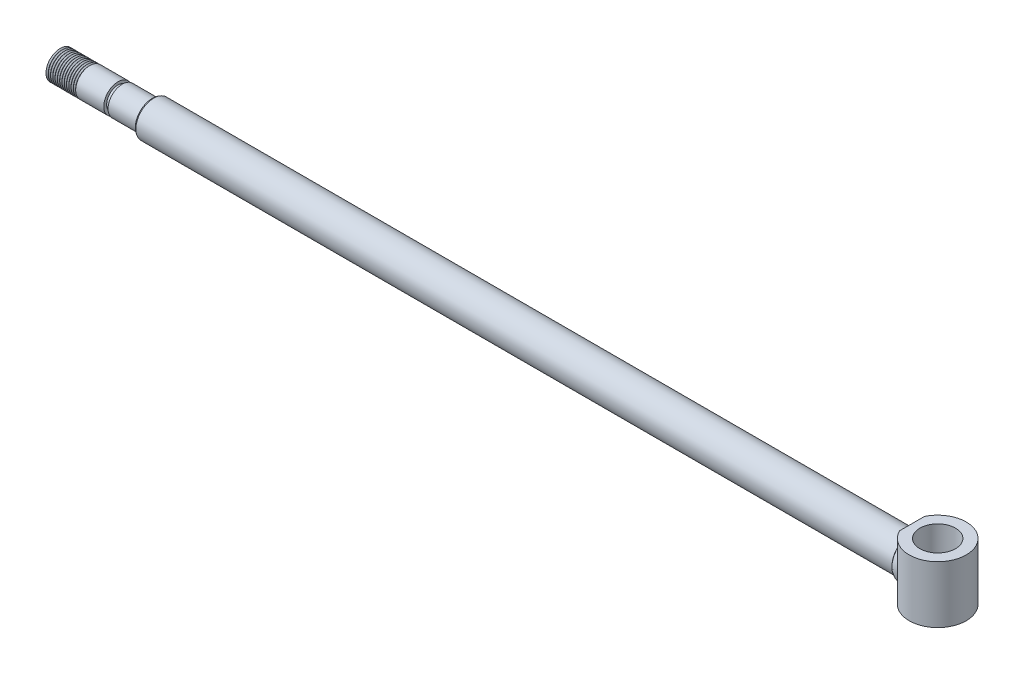
ISO-10303-21;
HEADER;
FILE_DESCRIPTION(('STEP AP214'),'2;1');
FILE_NAME('part.step','',(''),(''),'','','');
FILE_SCHEMA(('AUTOMOTIVE_DESIGN { 1 0 10303 214 1 1 1 1 }'));
ENDSEC;
DATA;
#1=APPLICATION_CONTEXT('core data for automotive mechanical design processes');
#2=APPLICATION_PROTOCOL_DEFINITION('international standard','automotive_design',2000,#1);
#3=PRODUCT_CONTEXT('',#1,'mechanical');
#4=PRODUCT('Part','Part','',(#3));
#5=PRODUCT_RELATED_PRODUCT_CATEGORY('part','',(#4));
#6=PRODUCT_DEFINITION_FORMATION('','',#4);
#7=PRODUCT_DEFINITION_CONTEXT('part definition',#1,'design');
#8=PRODUCT_DEFINITION('design','',#6,#7);
#9=PRODUCT_DEFINITION_SHAPE('','',#8);
#10=(LENGTH_UNIT() NAMED_UNIT(*) SI_UNIT(.MILLI.,.METRE.));
#11=(NAMED_UNIT(*) PLANE_ANGLE_UNIT() SI_UNIT($,.RADIAN.));
#12=(NAMED_UNIT(*) SI_UNIT($,.STERADIAN.) SOLID_ANGLE_UNIT());
#13=UNCERTAINTY_MEASURE_WITH_UNIT(LENGTH_MEASURE(1.E-05),#10,'distance_accuracy_value','');
#14=(GEOMETRIC_REPRESENTATION_CONTEXT(3) GLOBAL_UNCERTAINTY_ASSIGNED_CONTEXT((#13)) GLOBAL_UNIT_ASSIGNED_CONTEXT((#10,
#11,#12)) REPRESENTATION_CONTEXT('',''));
#15=CARTESIAN_POINT('',(0.,0.,0.));
#16=DIRECTION('',(0.,0.,1.));
#17=DIRECTION('',(1.,0.,0.));
#18=AXIS2_PLACEMENT_3D('',#15,#16,#17);
#19=CARTESIAN_POINT('',(0.,0.,0.));
#20=DIRECTION('',(-1.,0.,0.));
#21=DIRECTION('',(0.,0.,1.));
#22=AXIS2_PLACEMENT_3D('',#19,#20,#21);
#23=CYLINDRICAL_SURFACE('',#22,12.5);
#24=CARTESIAN_POINT('',(65.5000000000001,0.,0.));
#25=DIRECTION('',(1.,0.,0.));
#26=DIRECTION('',(0.,0.,-1.));
#27=AXIS2_PLACEMENT_3D('',#24,#25,#26);
#28=CIRCLE('',#27,12.5);
#29=CARTESIAN_POINT('',(65.5000000000001,0.,-12.5));
#30=VERTEX_POINT('',#29);
#31=EDGE_CURVE('E296',#30,#30,#28,.T.);
#32=ORIENTED_EDGE('',*,*,#31,.T.);
#33=EDGE_LOOP('',(#32));
#34=FACE_BOUND('',#33,.T.);
#35=CARTESIAN_POINT('',(595.500323734356,0.,0.));
#36=DIRECTION('',(-1.,0.,0.));
#37=DIRECTION('',(0.,0.,1.));
#38=AXIS2_PLACEMENT_3D('',#35,#36,#37);
#39=CIRCLE('',#38,12.5);
#40=CARTESIAN_POINT('',(595.500323734356,12.5,0.));
#41=VERTEX_POINT('',#40);
#42=EDGE_CURVE('E11',#41,#41,#39,.F.);
#43=ORIENTED_EDGE('',*,*,#42,.F.);
#44=EDGE_LOOP('',(#43));
#45=FACE_BOUND('',#44,.T.);
#46=ADVANCED_FACE('F34',(#34,#45),#23,.T.);
#47=CARTESIAN_POINT('',(0.,0.,0.));
#48=DIRECTION('',(1.,0.,0.));
#49=DIRECTION('',(0.,0.,-1.));
#50=AXIS2_PLACEMENT_3D('',#47,#48,#49);
#51=PLANE('',#50);
#52=CARTESIAN_POINT('',(0.,0.,0.));
#53=DIRECTION('',(-1.,0.,0.));
#54=DIRECTION('',(0.,0.,1.));
#55=AXIS2_PLACEMENT_3D('',#52,#53,#54);
#56=CIRCLE('',#55,10.);
#57=CARTESIAN_POINT('',(0.,0.,10.));
#58=VERTEX_POINT('',#57);
#59=EDGE_CURVE('E281',#58,#58,#56,.T.);
#60=ORIENTED_EDGE('',*,*,#59,.T.);
#61=EDGE_LOOP('',(#60));
#62=FACE_BOUND('',#61,.T.);
#63=ADVANCED_FACE('F141',(#62),#51,.F.);
#64=CARTESIAN_POINT('',(0.80000010516341,0.,0.));
#65=DIRECTION('',(-1.,0.,0.));
#66=DIRECTION('',(0.,0.,1.));
#67=AXIS2_PLACEMENT_3D('',#64,#65,#66);
#68=CONICAL_SURFACE('',#67,9.2,0.78539809767033);
#69=ORIENTED_EDGE('',*,*,#59,.F.);
#70=EDGE_LOOP('',(#69));
#71=FACE_BOUND('',#70,.T.);
#72=CARTESIAN_POINT('',(0.80000010516341,0.,0.));
#73=DIRECTION('',(-1.,0.,0.));
#74=DIRECTION('',(0.,0.,1.));
#75=AXIS2_PLACEMENT_3D('',#72,#73,#74);
#76=CIRCLE('',#75,9.2);
#77=CARTESIAN_POINT('',(0.80000010516341,0.,9.2));
#78=VERTEX_POINT('',#77);
#79=EDGE_CURVE('E284',#78,#78,#76,.T.);
#80=ORIENTED_EDGE('',*,*,#79,.T.);
#81=EDGE_LOOP('',(#80));
#82=FACE_BOUND('',#81,.T.);
#83=ADVANCED_FACE('F146',(#71,#82),#68,.T.);
#84=CARTESIAN_POINT('',(1.59999999999998,0.,0.));
#85=DIRECTION('',(1.,0.,0.));
#86=DIRECTION('',(0.,0.,-1.));
#87=AXIS2_PLACEMENT_3D('',#84,#85,#86);
#88=CONICAL_SURFACE('',#87,10.,0.7853982291246);
#89=ORIENTED_EDGE('',*,*,#79,.F.);
#90=EDGE_LOOP('',(#89));
#91=FACE_BOUND('',#90,.T.);
#92=CARTESIAN_POINT('',(1.59999999999998,0.,0.));
#93=DIRECTION('',(-1.,0.,0.));
#94=DIRECTION('',(0.,0.,1.));
#95=AXIS2_PLACEMENT_3D('',#92,#93,#94);
#96=CIRCLE('',#95,10.);
#97=CARTESIAN_POINT('',(1.59999999999998,0.,10.));
#98=VERTEX_POINT('',#97);
#99=EDGE_CURVE('E285',#98,#98,#96,.T.);
#100=ORIENTED_EDGE('',*,*,#99,.T.);
#101=EDGE_LOOP('',(#100));
#102=FACE_BOUND('',#101,.T.);
#103=ADVANCED_FACE('F269',(#91,#102),#88,.T.);
#104=CARTESIAN_POINT('',(2.40000010516341,0.,0.));
#105=DIRECTION('',(-1.,0.,0.));
#106=DIRECTION('',(0.,0.,1.));
#107=AXIS2_PLACEMENT_3D('',#104,#105,#106);
#108=CONICAL_SURFACE('',#107,9.2,0.785398097670306);
#109=ORIENTED_EDGE('',*,*,#99,.F.);
#110=EDGE_LOOP('',(#109));
#111=FACE_BOUND('',#110,.T.);
#112=CARTESIAN_POINT('',(2.40000010516341,0.,0.));
#113=DIRECTION('',(-1.,0.,0.));
#114=DIRECTION('',(0.,0.,1.));
#115=AXIS2_PLACEMENT_3D('',#112,#113,#114);
#116=CIRCLE('',#115,9.2);
#117=CARTESIAN_POINT('',(2.40000010516341,0.,9.2));
#118=VERTEX_POINT('',#117);
#119=EDGE_CURVE('E290',#118,#118,#116,.T.);
#120=ORIENTED_EDGE('',*,*,#119,.T.);
#121=EDGE_LOOP('',(#120));
#122=FACE_BOUND('',#121,.T.);
#123=ADVANCED_FACE('F265',(#111,#122),#108,.T.);
#124=CARTESIAN_POINT('',(3.19999999999997,0.,0.));
#125=DIRECTION('',(1.,0.,0.));
#126=DIRECTION('',(0.,0.,-1.));
#127=AXIS2_PLACEMENT_3D('',#124,#125,#126);
#128=CONICAL_SURFACE('',#127,10.,0.785398229124599);
#129=ORIENTED_EDGE('',*,*,#119,.F.);
#130=EDGE_LOOP('',(#129));
#131=FACE_BOUND('',#130,.T.);
#132=CARTESIAN_POINT('',(3.19999999999997,0.,0.));
#133=DIRECTION('',(-1.,0.,0.));
#134=DIRECTION('',(0.,0.,1.));
#135=AXIS2_PLACEMENT_3D('',#132,#133,#134);
#136=CIRCLE('',#135,10.);
#137=CARTESIAN_POINT('',(3.19999999999997,0.,10.));
#138=VERTEX_POINT('',#137);
#139=EDGE_CURVE('E396',#138,#138,#136,.T.);
#140=ORIENTED_EDGE('',*,*,#139,.T.);
#141=EDGE_LOOP('',(#140));
#142=FACE_BOUND('',#141,.T.);
#143=ADVANCED_FACE('F261',(#131,#142),#128,.T.);
#144=CARTESIAN_POINT('',(4.00000010516341,0.,0.));
#145=DIRECTION('',(-1.,0.,0.));
#146=DIRECTION('',(0.,0.,1.));
#147=AXIS2_PLACEMENT_3D('',#144,#145,#146);
#148=CONICAL_SURFACE('',#147,9.2,0.785398097670305);
#149=ORIENTED_EDGE('',*,*,#139,.F.);
#150=EDGE_LOOP('',(#149));
#151=FACE_BOUND('',#150,.T.);
#152=CARTESIAN_POINT('',(4.00000010516341,0.,0.));
#153=DIRECTION('',(-1.,0.,0.));
#154=DIRECTION('',(0.,0.,1.));
#155=AXIS2_PLACEMENT_3D('',#152,#153,#154);
#156=CIRCLE('',#155,9.2);
#157=CARTESIAN_POINT('',(4.00000010516341,0.,9.2));
#158=VERTEX_POINT('',#157);
#159=EDGE_CURVE('E393',#158,#158,#156,.T.);
#160=ORIENTED_EDGE('',*,*,#159,.T.);
#161=EDGE_LOOP('',(#160));
#162=FACE_BOUND('',#161,.T.);
#163=ADVANCED_FACE('F257',(#151,#162),#148,.T.);
#164=CARTESIAN_POINT('',(4.8,0.,0.));
#165=DIRECTION('',(1.,0.,0.));
#166=DIRECTION('',(0.,0.,-1.));
#167=AXIS2_PLACEMENT_3D('',#164,#165,#166);
#168=CONICAL_SURFACE('',#167,10.,0.785398229124583);
#169=ORIENTED_EDGE('',*,*,#159,.F.);
#170=EDGE_LOOP('',(#169));
#171=FACE_BOUND('',#170,.T.);
#172=CARTESIAN_POINT('',(4.8,0.,0.));
#173=DIRECTION('',(-1.,0.,0.));
#174=DIRECTION('',(0.,0.,1.));
#175=AXIS2_PLACEMENT_3D('',#172,#173,#174);
#176=CIRCLE('',#175,10.);
#177=CARTESIAN_POINT('',(4.8,0.,10.));
#178=VERTEX_POINT('',#177);
#179=EDGE_CURVE('E390',#178,#178,#176,.T.);
#180=ORIENTED_EDGE('',*,*,#179,.T.);
#181=EDGE_LOOP('',(#180));
#182=FACE_BOUND('',#181,.T.);
#183=ADVANCED_FACE('F253',(#171,#182),#168,.T.);
#184=CARTESIAN_POINT('',(5.60000010516341,0.,0.));
#185=DIRECTION('',(-1.,0.,0.));
#186=DIRECTION('',(0.,0.,1.));
#187=AXIS2_PLACEMENT_3D('',#184,#185,#186);
#188=CONICAL_SURFACE('',#187,9.2,0.785398097670321);
#189=ORIENTED_EDGE('',*,*,#179,.F.);
#190=EDGE_LOOP('',(#189));
#191=FACE_BOUND('',#190,.T.);
#192=CARTESIAN_POINT('',(5.60000010516341,0.,0.));
#193=DIRECTION('',(-1.,0.,0.));
#194=DIRECTION('',(0.,0.,1.));
#195=AXIS2_PLACEMENT_3D('',#192,#193,#194);
#196=CIRCLE('',#195,9.2);
#197=CARTESIAN_POINT('',(5.60000010516341,0.,9.2));
#198=VERTEX_POINT('',#197);
#199=EDGE_CURVE('E387',#198,#198,#196,.T.);
#200=ORIENTED_EDGE('',*,*,#199,.T.);
#201=EDGE_LOOP('',(#200));
#202=FACE_BOUND('',#201,.T.);
#203=ADVANCED_FACE('F249',(#191,#202),#188,.T.);
#204=CARTESIAN_POINT('',(6.4,0.,0.));
#205=DIRECTION('',(1.,0.,0.));
#206=DIRECTION('',(0.,0.,-1.));
#207=AXIS2_PLACEMENT_3D('',#204,#205,#206);
#208=CONICAL_SURFACE('',#207,10.,0.785398229124583);
#209=ORIENTED_EDGE('',*,*,#199,.F.);
#210=EDGE_LOOP('',(#209));
#211=FACE_BOUND('',#210,.T.);
#212=CARTESIAN_POINT('',(6.4,0.,0.));
#213=DIRECTION('',(-1.,0.,0.));
#214=DIRECTION('',(0.,0.,1.));
#215=AXIS2_PLACEMENT_3D('',#212,#213,#214);
#216=CIRCLE('',#215,10.);
#217=CARTESIAN_POINT('',(6.4,0.,10.));
#218=VERTEX_POINT('',#217);
#219=EDGE_CURVE('E384',#218,#218,#216,.T.);
#220=ORIENTED_EDGE('',*,*,#219,.T.);
#221=EDGE_LOOP('',(#220));
#222=FACE_BOUND('',#221,.T.);
#223=ADVANCED_FACE('F245',(#211,#222),#208,.T.);
#224=CARTESIAN_POINT('',(7.20000010516341,0.,0.));
#225=DIRECTION('',(-1.,0.,0.));
#226=DIRECTION('',(0.,0.,1.));
#227=AXIS2_PLACEMENT_3D('',#224,#225,#226);
#228=CONICAL_SURFACE('',#227,9.2,0.785398097670321);
#229=ORIENTED_EDGE('',*,*,#219,.F.);
#230=EDGE_LOOP('',(#229));
#231=FACE_BOUND('',#230,.T.);
#232=CARTESIAN_POINT('',(7.20000010516341,0.,0.));
#233=DIRECTION('',(-1.,0.,0.));
#234=DIRECTION('',(0.,0.,1.));
#235=AXIS2_PLACEMENT_3D('',#232,#233,#234);
#236=CIRCLE('',#235,9.2);
#237=CARTESIAN_POINT('',(7.20000010516341,0.,9.2));
#238=VERTEX_POINT('',#237);
#239=EDGE_CURVE('E381',#238,#238,#236,.T.);
#240=ORIENTED_EDGE('',*,*,#239,.T.);
#241=EDGE_LOOP('',(#240));
#242=FACE_BOUND('',#241,.T.);
#243=ADVANCED_FACE('F241',(#231,#242),#228,.T.);
#244=CARTESIAN_POINT('',(8.,0.,0.));
#245=DIRECTION('',(1.,0.,0.));
#246=DIRECTION('',(0.,0.,-1.));
#247=AXIS2_PLACEMENT_3D('',#244,#245,#246);
#248=CONICAL_SURFACE('',#247,10.,0.785398229124583);
#249=ORIENTED_EDGE('',*,*,#239,.F.);
#250=EDGE_LOOP('',(#249));
#251=FACE_BOUND('',#250,.T.);
#252=CARTESIAN_POINT('',(8.,0.,0.));
#253=DIRECTION('',(-1.,0.,0.));
#254=DIRECTION('',(0.,0.,1.));
#255=AXIS2_PLACEMENT_3D('',#252,#253,#254);
#256=CIRCLE('',#255,10.);
#257=CARTESIAN_POINT('',(8.,0.,10.));
#258=VERTEX_POINT('',#257);
#259=EDGE_CURVE('E378',#258,#258,#256,.T.);
#260=ORIENTED_EDGE('',*,*,#259,.T.);
#261=EDGE_LOOP('',(#260));
#262=FACE_BOUND('',#261,.T.);
#263=ADVANCED_FACE('F237',(#251,#262),#248,.T.);
#264=CARTESIAN_POINT('',(8.80000010516341,0.,0.));
#265=DIRECTION('',(-1.,0.,0.));
#266=DIRECTION('',(0.,0.,1.));
#267=AXIS2_PLACEMENT_3D('',#264,#265,#266);
#268=CONICAL_SURFACE('',#267,9.2,0.785398097670321);
#269=ORIENTED_EDGE('',*,*,#259,.F.);
#270=EDGE_LOOP('',(#269));
#271=FACE_BOUND('',#270,.T.);
#272=CARTESIAN_POINT('',(8.80000010516341,0.,0.));
#273=DIRECTION('',(-1.,0.,0.));
#274=DIRECTION('',(0.,0.,1.));
#275=AXIS2_PLACEMENT_3D('',#272,#273,#274);
#276=CIRCLE('',#275,9.2);
#277=CARTESIAN_POINT('',(8.80000010516341,0.,9.2));
#278=VERTEX_POINT('',#277);
#279=EDGE_CURVE('E375',#278,#278,#276,.T.);
#280=ORIENTED_EDGE('',*,*,#279,.T.);
#281=EDGE_LOOP('',(#280));
#282=FACE_BOUND('',#281,.T.);
#283=ADVANCED_FACE('F233',(#271,#282),#268,.T.);
#284=CARTESIAN_POINT('',(9.6,0.,0.));
#285=DIRECTION('',(1.,0.,0.));
#286=DIRECTION('',(0.,0.,-1.));
#287=AXIS2_PLACEMENT_3D('',#284,#285,#286);
#288=CONICAL_SURFACE('',#287,10.,0.785398229124582);
#289=ORIENTED_EDGE('',*,*,#279,.F.);
#290=EDGE_LOOP('',(#289));
#291=FACE_BOUND('',#290,.T.);
#292=CARTESIAN_POINT('',(9.6,0.,0.));
#293=DIRECTION('',(-1.,0.,0.));
#294=DIRECTION('',(0.,0.,1.));
#295=AXIS2_PLACEMENT_3D('',#292,#293,#294);
#296=CIRCLE('',#295,10.);
#297=CARTESIAN_POINT('',(9.6,0.,10.));
#298=VERTEX_POINT('',#297);
#299=EDGE_CURVE('E372',#298,#298,#296,.T.);
#300=ORIENTED_EDGE('',*,*,#299,.T.);
#301=EDGE_LOOP('',(#300));
#302=FACE_BOUND('',#301,.T.);
#303=ADVANCED_FACE('F229',(#291,#302),#288,.T.);
#304=CARTESIAN_POINT('',(10.4000001051634,0.,0.));
#305=DIRECTION('',(-1.,0.,0.));
#306=DIRECTION('',(0.,0.,1.));
#307=AXIS2_PLACEMENT_3D('',#304,#305,#306);
#308=CONICAL_SURFACE('',#307,9.2,0.785398097670321);
#309=ORIENTED_EDGE('',*,*,#299,.F.);
#310=EDGE_LOOP('',(#309));
#311=FACE_BOUND('',#310,.T.);
#312=CARTESIAN_POINT('',(10.4000001051634,0.,0.));
#313=DIRECTION('',(-1.,0.,0.));
#314=DIRECTION('',(0.,0.,1.));
#315=AXIS2_PLACEMENT_3D('',#312,#313,#314);
#316=CIRCLE('',#315,9.2);
#317=CARTESIAN_POINT('',(10.4000001051634,0.,9.2));
#318=VERTEX_POINT('',#317);
#319=EDGE_CURVE('E369',#318,#318,#316,.T.);
#320=ORIENTED_EDGE('',*,*,#319,.T.);
#321=EDGE_LOOP('',(#320));
#322=FACE_BOUND('',#321,.T.);
#323=ADVANCED_FACE('F225',(#311,#322),#308,.T.);
#324=CARTESIAN_POINT('',(11.2,0.,0.));
#325=DIRECTION('',(1.,0.,0.));
#326=DIRECTION('',(0.,0.,-1.));
#327=AXIS2_PLACEMENT_3D('',#324,#325,#326);
#328=CONICAL_SURFACE('',#327,10.,0.785398229124582);
#329=ORIENTED_EDGE('',*,*,#319,.F.);
#330=EDGE_LOOP('',(#329));
#331=FACE_BOUND('',#330,.T.);
#332=CARTESIAN_POINT('',(11.2,0.,0.));
#333=DIRECTION('',(-1.,0.,0.));
#334=DIRECTION('',(0.,0.,1.));
#335=AXIS2_PLACEMENT_3D('',#332,#333,#334);
#336=CIRCLE('',#335,10.);
#337=CARTESIAN_POINT('',(11.2,0.,10.));
#338=VERTEX_POINT('',#337);
#339=EDGE_CURVE('E366',#338,#338,#336,.T.);
#340=ORIENTED_EDGE('',*,*,#339,.T.);
#341=EDGE_LOOP('',(#340));
#342=FACE_BOUND('',#341,.T.);
#343=ADVANCED_FACE('F221',(#331,#342),#328,.T.);
#344=CARTESIAN_POINT('',(12.0000001051634,0.,0.));
#345=DIRECTION('',(-1.,0.,0.));
#346=DIRECTION('',(0.,0.,1.));
#347=AXIS2_PLACEMENT_3D('',#344,#345,#346);
#348=CONICAL_SURFACE('',#347,9.2,0.785398097670322);
#349=ORIENTED_EDGE('',*,*,#339,.F.);
#350=EDGE_LOOP('',(#349));
#351=FACE_BOUND('',#350,.T.);
#352=CARTESIAN_POINT('',(12.0000001051634,0.,0.));
#353=DIRECTION('',(-1.,0.,0.));
#354=DIRECTION('',(0.,0.,1.));
#355=AXIS2_PLACEMENT_3D('',#352,#353,#354);
#356=CIRCLE('',#355,9.2);
#357=CARTESIAN_POINT('',(12.0000001051634,0.,9.2));
#358=VERTEX_POINT('',#357);
#359=EDGE_CURVE('E363',#358,#358,#356,.T.);
#360=ORIENTED_EDGE('',*,*,#359,.T.);
#361=EDGE_LOOP('',(#360));
#362=FACE_BOUND('',#361,.T.);
#363=ADVANCED_FACE('F217',(#351,#362),#348,.T.);
#364=CARTESIAN_POINT('',(12.8,0.,0.));
#365=DIRECTION('',(1.,0.,0.));
#366=DIRECTION('',(0.,0.,-1.));
#367=AXIS2_PLACEMENT_3D('',#364,#365,#366);
#368=CONICAL_SURFACE('',#367,10.,0.785398229124582);
#369=ORIENTED_EDGE('',*,*,#359,.F.);
#370=EDGE_LOOP('',(#369));
#371=FACE_BOUND('',#370,.T.);
#372=CARTESIAN_POINT('',(12.8,0.,0.));
#373=DIRECTION('',(-1.,0.,0.));
#374=DIRECTION('',(0.,0.,1.));
#375=AXIS2_PLACEMENT_3D('',#372,#373,#374);
#376=CIRCLE('',#375,10.);
#377=CARTESIAN_POINT('',(12.8,0.,10.));
#378=VERTEX_POINT('',#377);
#379=EDGE_CURVE('E360',#378,#378,#376,.T.);
#380=ORIENTED_EDGE('',*,*,#379,.T.);
#381=EDGE_LOOP('',(#380));
#382=FACE_BOUND('',#381,.T.);
#383=ADVANCED_FACE('F213',(#371,#382),#368,.T.);
#384=CARTESIAN_POINT('',(13.6000001051634,0.,0.));
#385=DIRECTION('',(-1.,0.,0.));
#386=DIRECTION('',(0.,0.,1.));
#387=AXIS2_PLACEMENT_3D('',#384,#385,#386);
#388=CONICAL_SURFACE('',#387,9.2,0.785398097670321);
#389=ORIENTED_EDGE('',*,*,#379,.F.);
#390=EDGE_LOOP('',(#389));
#391=FACE_BOUND('',#390,.T.);
#392=CARTESIAN_POINT('',(13.6000001051634,0.,0.));
#393=DIRECTION('',(-1.,0.,0.));
#394=DIRECTION('',(0.,0.,1.));
#395=AXIS2_PLACEMENT_3D('',#392,#393,#394);
#396=CIRCLE('',#395,9.2);
#397=CARTESIAN_POINT('',(13.6000001051634,0.,9.2));
#398=VERTEX_POINT('',#397);
#399=EDGE_CURVE('E357',#398,#398,#396,.T.);
#400=ORIENTED_EDGE('',*,*,#399,.T.);
#401=EDGE_LOOP('',(#400));
#402=FACE_BOUND('',#401,.T.);
#403=ADVANCED_FACE('F209',(#391,#402),#388,.T.);
#404=CARTESIAN_POINT('',(14.4,0.,0.));
#405=DIRECTION('',(1.,0.,0.));
#406=DIRECTION('',(0.,0.,-1.));
#407=AXIS2_PLACEMENT_3D('',#404,#405,#406);
#408=CONICAL_SURFACE('',#407,10.,0.785398229124582);
#409=ORIENTED_EDGE('',*,*,#399,.F.);
#410=EDGE_LOOP('',(#409));
#411=FACE_BOUND('',#410,.T.);
#412=CARTESIAN_POINT('',(14.4,0.,0.));
#413=DIRECTION('',(-1.,0.,0.));
#414=DIRECTION('',(0.,0.,1.));
#415=AXIS2_PLACEMENT_3D('',#412,#413,#414);
#416=CIRCLE('',#415,10.);
#417=CARTESIAN_POINT('',(14.4,0.,10.));
#418=VERTEX_POINT('',#417);
#419=EDGE_CURVE('E354',#418,#418,#416,.T.);
#420=ORIENTED_EDGE('',*,*,#419,.T.);
#421=EDGE_LOOP('',(#420));
#422=FACE_BOUND('',#421,.T.);
#423=ADVANCED_FACE('F205',(#411,#422),#408,.T.);
#424=CARTESIAN_POINT('',(15.2000001051634,0.,0.));
#425=DIRECTION('',(-1.,0.,0.));
#426=DIRECTION('',(0.,0.,1.));
#427=AXIS2_PLACEMENT_3D('',#424,#425,#426);
#428=CONICAL_SURFACE('',#427,9.2,0.785398097670321);
#429=ORIENTED_EDGE('',*,*,#419,.F.);
#430=EDGE_LOOP('',(#429));
#431=FACE_BOUND('',#430,.T.);
#432=CARTESIAN_POINT('',(15.2000001051634,0.,0.));
#433=DIRECTION('',(-1.,0.,0.));
#434=DIRECTION('',(0.,0.,1.));
#435=AXIS2_PLACEMENT_3D('',#432,#433,#434);
#436=CIRCLE('',#435,9.2);
#437=CARTESIAN_POINT('',(15.2000001051634,0.,9.2));
#438=VERTEX_POINT('',#437);
#439=EDGE_CURVE('E351',#438,#438,#436,.T.);
#440=ORIENTED_EDGE('',*,*,#439,.T.);
#441=EDGE_LOOP('',(#440));
#442=FACE_BOUND('',#441,.T.);
#443=ADVANCED_FACE('F201',(#431,#442),#428,.T.);
#444=CARTESIAN_POINT('',(16.,0.,0.));
#445=DIRECTION('',(1.,0.,0.));
#446=DIRECTION('',(0.,0.,-1.));
#447=AXIS2_PLACEMENT_3D('',#444,#445,#446);
#448=CONICAL_SURFACE('',#447,10.,0.785398229124583);
#449=ORIENTED_EDGE('',*,*,#439,.F.);
#450=EDGE_LOOP('',(#449));
#451=FACE_BOUND('',#450,.T.);
#452=CARTESIAN_POINT('',(16.,0.,0.));
#453=DIRECTION('',(-1.,0.,0.));
#454=DIRECTION('',(0.,0.,1.));
#455=AXIS2_PLACEMENT_3D('',#452,#453,#454);
#456=CIRCLE('',#455,10.);
#457=CARTESIAN_POINT('',(16.,0.,10.));
#458=VERTEX_POINT('',#457);
#459=EDGE_CURVE('E348',#458,#458,#456,.T.);
#460=ORIENTED_EDGE('',*,*,#459,.T.);
#461=EDGE_LOOP('',(#460));
#462=FACE_BOUND('',#461,.T.);
#463=ADVANCED_FACE('F197',(#451,#462),#448,.T.);
#464=CARTESIAN_POINT('',(16.8000001051634,0.,0.));
#465=DIRECTION('',(-1.,0.,0.));
#466=DIRECTION('',(0.,0.,1.));
#467=AXIS2_PLACEMENT_3D('',#464,#465,#466);
#468=CONICAL_SURFACE('',#467,9.2,0.78539809767032);
#469=ORIENTED_EDGE('',*,*,#459,.F.);
#470=EDGE_LOOP('',(#469));
#471=FACE_BOUND('',#470,.T.);
#472=CARTESIAN_POINT('',(16.8000001051634,0.,0.));
#473=DIRECTION('',(-1.,0.,0.));
#474=DIRECTION('',(0.,0.,1.));
#475=AXIS2_PLACEMENT_3D('',#472,#473,#474);
#476=CIRCLE('',#475,9.2);
#477=CARTESIAN_POINT('',(16.8000001051634,0.,9.2));
#478=VERTEX_POINT('',#477);
#479=EDGE_CURVE('E345',#478,#478,#476,.T.);
#480=ORIENTED_EDGE('',*,*,#479,.T.);
#481=EDGE_LOOP('',(#480));
#482=FACE_BOUND('',#481,.T.);
#483=ADVANCED_FACE('F193',(#471,#482),#468,.T.);
#484=CARTESIAN_POINT('',(17.6,0.,0.));
#485=DIRECTION('',(1.,0.,0.));
#486=DIRECTION('',(0.,0.,-1.));
#487=AXIS2_PLACEMENT_3D('',#484,#485,#486);
#488=CONICAL_SURFACE('',#487,10.,0.785398229124583);
#489=ORIENTED_EDGE('',*,*,#479,.F.);
#490=EDGE_LOOP('',(#489));
#491=FACE_BOUND('',#490,.T.);
#492=CARTESIAN_POINT('',(17.6,0.,0.));
#493=DIRECTION('',(-1.,0.,0.));
#494=DIRECTION('',(0.,0.,1.));
#495=AXIS2_PLACEMENT_3D('',#492,#493,#494);
#496=CIRCLE('',#495,10.);
#497=CARTESIAN_POINT('',(17.6,0.,10.));
#498=VERTEX_POINT('',#497);
#499=EDGE_CURVE('E342',#498,#498,#496,.T.);
#500=ORIENTED_EDGE('',*,*,#499,.T.);
#501=EDGE_LOOP('',(#500));
#502=FACE_BOUND('',#501,.T.);
#503=ADVANCED_FACE('F189',(#491,#502),#488,.T.);
#504=CARTESIAN_POINT('',(18.4000001051634,0.,0.));
#505=DIRECTION('',(-1.,0.,0.));
#506=DIRECTION('',(0.,0.,1.));
#507=AXIS2_PLACEMENT_3D('',#504,#505,#506);
#508=CONICAL_SURFACE('',#507,9.2,0.78539809767032);
#509=ORIENTED_EDGE('',*,*,#499,.F.);
#510=EDGE_LOOP('',(#509));
#511=FACE_BOUND('',#510,.T.);
#512=CARTESIAN_POINT('',(18.4000001051634,0.,0.));
#513=DIRECTION('',(-1.,0.,0.));
#514=DIRECTION('',(0.,0.,1.));
#515=AXIS2_PLACEMENT_3D('',#512,#513,#514);
#516=CIRCLE('',#515,9.2);
#517=CARTESIAN_POINT('',(18.4000001051634,0.,9.2));
#518=VERTEX_POINT('',#517);
#519=EDGE_CURVE('E339',#518,#518,#516,.T.);
#520=ORIENTED_EDGE('',*,*,#519,.T.);
#521=EDGE_LOOP('',(#520));
#522=FACE_BOUND('',#521,.T.);
#523=ADVANCED_FACE('F185',(#511,#522),#508,.T.);
#524=CARTESIAN_POINT('',(19.2,0.,0.));
#525=DIRECTION('',(1.,0.,0.));
#526=DIRECTION('',(0.,0.,-1.));
#527=AXIS2_PLACEMENT_3D('',#524,#525,#526);
#528=CONICAL_SURFACE('',#527,10.,0.785398229124583);
#529=ORIENTED_EDGE('',*,*,#519,.F.);
#530=EDGE_LOOP('',(#529));
#531=FACE_BOUND('',#530,.T.);
#532=CARTESIAN_POINT('',(19.2,0.,0.));
#533=DIRECTION('',(-1.,0.,0.));
#534=DIRECTION('',(0.,0.,1.));
#535=AXIS2_PLACEMENT_3D('',#532,#533,#534);
#536=CIRCLE('',#535,10.);
#537=CARTESIAN_POINT('',(19.2,0.,10.));
#538=VERTEX_POINT('',#537);
#539=EDGE_CURVE('E336',#538,#538,#536,.T.);
#540=ORIENTED_EDGE('',*,*,#539,.T.);
#541=EDGE_LOOP('',(#540));
#542=FACE_BOUND('',#541,.T.);
#543=ADVANCED_FACE('F181',(#531,#542),#528,.T.);
#544=CARTESIAN_POINT('',(20.0000001051634,0.,0.));
#545=DIRECTION('',(-1.,0.,0.));
#546=DIRECTION('',(0.,0.,1.));
#547=AXIS2_PLACEMENT_3D('',#544,#545,#546);
#548=CONICAL_SURFACE('',#547,9.2,0.78539809767032);
#549=ORIENTED_EDGE('',*,*,#539,.F.);
#550=EDGE_LOOP('',(#549));
#551=FACE_BOUND('',#550,.T.);
#552=CARTESIAN_POINT('',(20.0000001051634,0.,0.));
#553=DIRECTION('',(-1.,0.,0.));
#554=DIRECTION('',(0.,0.,1.));
#555=AXIS2_PLACEMENT_3D('',#552,#553,#554);
#556=CIRCLE('',#555,9.2);
#557=CARTESIAN_POINT('',(20.0000001051634,0.,9.2));
#558=VERTEX_POINT('',#557);
#559=EDGE_CURVE('E333',#558,#558,#556,.T.);
#560=ORIENTED_EDGE('',*,*,#559,.T.);
#561=EDGE_LOOP('',(#560));
#562=FACE_BOUND('',#561,.T.);
#563=ADVANCED_FACE('F177',(#551,#562),#548,.T.);
#564=CARTESIAN_POINT('',(20.8,0.,0.));
#565=DIRECTION('',(1.,0.,0.));
#566=DIRECTION('',(0.,0.,-1.));
#567=AXIS2_PLACEMENT_3D('',#564,#565,#566);
#568=CONICAL_SURFACE('',#567,10.,0.785398229124583);
#569=ORIENTED_EDGE('',*,*,#559,.F.);
#570=EDGE_LOOP('',(#569));
#571=FACE_BOUND('',#570,.T.);
#572=CARTESIAN_POINT('',(20.8,0.,0.));
#573=DIRECTION('',(-1.,0.,0.));
#574=DIRECTION('',(0.,0.,1.));
#575=AXIS2_PLACEMENT_3D('',#572,#573,#574);
#576=CIRCLE('',#575,10.);
#577=CARTESIAN_POINT('',(20.8,0.,10.));
#578=VERTEX_POINT('',#577);
#579=EDGE_CURVE('E330',#578,#578,#576,.T.);
#580=ORIENTED_EDGE('',*,*,#579,.T.);
#581=EDGE_LOOP('',(#580));
#582=FACE_BOUND('',#581,.T.);
#583=ADVANCED_FACE('F173',(#571,#582),#568,.T.);
#584=CARTESIAN_POINT('',(0.,0.,0.));
#585=DIRECTION('',(-1.,0.,0.));
#586=DIRECTION('',(0.,0.,1.));
#587=AXIS2_PLACEMENT_3D('',#584,#585,#586);
#588=CYLINDRICAL_SURFACE('',#587,10.);
#589=ORIENTED_EDGE('',*,*,#579,.F.);
#590=EDGE_LOOP('',(#589));
#591=FACE_BOUND('',#590,.T.);
#592=CARTESIAN_POINT('',(40.5,0.,0.));
#593=DIRECTION('',(-1.,0.,0.));
#594=DIRECTION('',(0.,0.,1.));
#595=AXIS2_PLACEMENT_3D('',#592,#593,#594);
#596=CIRCLE('',#595,10.);
#597=CARTESIAN_POINT('',(40.5,0.,10.));
#598=VERTEX_POINT('',#597);
#599=EDGE_CURVE('E327',#598,#598,#596,.T.);
#600=ORIENTED_EDGE('',*,*,#599,.T.);
#601=EDGE_LOOP('',(#600));
#602=FACE_BOUND('',#601,.T.);
#603=ADVANCED_FACE('F169',(#591,#602),#588,.T.);
#604=CARTESIAN_POINT('',(40.5,10.,0.));
#605=DIRECTION('',(-1.,0.,0.));
#606=DIRECTION('',(0.,0.,1.));
#607=AXIS2_PLACEMENT_3D('',#604,#605,#606);
#608=PLANE('',#607);
#609=ORIENTED_EDGE('',*,*,#599,.F.);
#610=EDGE_LOOP('',(#609));
#611=FACE_BOUND('',#610,.T.);
#612=CARTESIAN_POINT('',(40.5,0.,0.));
#613=DIRECTION('',(-1.,0.,0.));
#614=DIRECTION('',(0.,0.,1.));
#615=AXIS2_PLACEMENT_3D('',#612,#613,#614);
#616=CIRCLE('',#615,8.);
#617=CARTESIAN_POINT('',(40.5,0.,8.));
#618=VERTEX_POINT('',#617);
#619=EDGE_CURVE('E324',#618,#618,#616,.T.);
#620=ORIENTED_EDGE('',*,*,#619,.T.);
#621=EDGE_LOOP('',(#620));
#622=FACE_BOUND('',#621,.T.);
#623=ADVANCED_FACE('F165',(#611,#622),#608,.F.);
#624=CARTESIAN_POINT('',(0.,0.,0.));
#625=DIRECTION('',(-1.,0.,0.));
#626=DIRECTION('',(0.,0.,1.));
#627=AXIS2_PLACEMENT_3D('',#624,#625,#626);
#628=CYLINDRICAL_SURFACE('',#627,8.);
#629=ORIENTED_EDGE('',*,*,#619,.F.);
#630=EDGE_LOOP('',(#629));
#631=FACE_BOUND('',#630,.T.);
#632=CARTESIAN_POINT('',(43.5,0.,0.));
#633=DIRECTION('',(-1.,0.,0.));
#634=DIRECTION('',(0.,0.,1.));
#635=AXIS2_PLACEMENT_3D('',#632,#633,#634);
#636=CIRCLE('',#635,8.);
#637=CARTESIAN_POINT('',(43.5,0.,8.));
#638=VERTEX_POINT('',#637);
#639=EDGE_CURVE('E321',#638,#638,#636,.T.);
#640=ORIENTED_EDGE('',*,*,#639,.T.);
#641=EDGE_LOOP('',(#640));
#642=FACE_BOUND('',#641,.T.);
#643=ADVANCED_FACE('F161',(#631,#642),#628,.T.);
#644=CARTESIAN_POINT('',(43.5,8.,0.));
#645=DIRECTION('',(1.,0.,0.));
#646=DIRECTION('',(0.,0.,-1.));
#647=AXIS2_PLACEMENT_3D('',#644,#645,#646);
#648=PLANE('',#647);
#649=ORIENTED_EDGE('',*,*,#639,.F.);
#650=EDGE_LOOP('',(#649));
#651=FACE_BOUND('',#650,.T.);
#652=CARTESIAN_POINT('',(43.5,0.,0.));
#653=DIRECTION('',(-1.,0.,0.));
#654=DIRECTION('',(0.,0.,1.));
#655=AXIS2_PLACEMENT_3D('',#652,#653,#654);
#656=CIRCLE('',#655,9.99999999999987);
#657=CARTESIAN_POINT('',(43.5,0.,9.99999999999987));
#658=VERTEX_POINT('',#657);
#659=EDGE_CURVE('E318',#658,#658,#656,.T.);
#660=ORIENTED_EDGE('',*,*,#659,.T.);
#661=EDGE_LOOP('',(#660));
#662=FACE_BOUND('',#661,.T.);
#663=ADVANCED_FACE('F157',(#651,#662),#648,.F.);
#664=CARTESIAN_POINT('',(0.,0.,0.));
#665=DIRECTION('',(-1.,0.,0.));
#666=DIRECTION('',(0.,0.,1.));
#667=AXIS2_PLACEMENT_3D('',#664,#665,#666);
#668=CYLINDRICAL_SURFACE('',#667,9.99999999999984);
#669=ORIENTED_EDGE('',*,*,#659,.F.);
#670=EDGE_LOOP('',(#669));
#671=FACE_BOUND('',#670,.T.);
#672=CARTESIAN_POINT('',(64.5,0.,0.));
#673=DIRECTION('',(-1.,0.,0.));
#674=DIRECTION('',(0.,0.,1.));
#675=AXIS2_PLACEMENT_3D('',#672,#673,#674);
#676=CIRCLE('',#675,9.99999999999981);
#677=CARTESIAN_POINT('',(64.5,0.,9.99999999999981));
#678=VERTEX_POINT('',#677);
#679=EDGE_CURVE('E312',#678,#678,#676,.T.);
#680=ORIENTED_EDGE('',*,*,#679,.T.);
#681=EDGE_LOOP('',(#680));
#682=FACE_BOUND('',#681,.T.);
#683=ADVANCED_FACE('F153',(#671,#682),#668,.T.);
#684=CARTESIAN_POINT('',(64.5,9.99999999999981,0.));
#685=DIRECTION('',(1.,0.,0.));
#686=DIRECTION('',(0.,0.,-1.));
#687=AXIS2_PLACEMENT_3D('',#684,#685,#686);
#688=PLANE('',#687);
#689=CARTESIAN_POINT('',(64.5,0.,0.));
#690=DIRECTION('',(1.,0.,0.));
#691=DIRECTION('',(0.,0.,-1.));
#692=AXIS2_PLACEMENT_3D('',#689,#690,#691);
#693=CIRCLE('',#692,11.9226497308104);
#694=CARTESIAN_POINT('',(64.5,0.,-11.9226497308104));
#695=VERTEX_POINT('',#694);
#696=EDGE_CURVE('E287',#695,#695,#693,.F.);
#697=ORIENTED_EDGE('',*,*,#696,.T.);
#698=EDGE_LOOP('',(#697));
#699=FACE_BOUND('',#698,.T.);
#700=ORIENTED_EDGE('',*,*,#679,.F.);
#701=EDGE_LOOP('',(#700));
#702=FACE_BOUND('',#701,.T.);
#703=ADVANCED_FACE('F150',(#699,#702),#688,.F.);
#704=CARTESIAN_POINT('',(64.5,0.,0.));
#705=DIRECTION('',(1.,0.,0.));
#706=DIRECTION('',(0.,0.,-1.));
#707=AXIS2_PLACEMENT_3D('',#704,#705,#706);
#708=CONICAL_SURFACE('',#707,11.9226497308104,0.523598775598253);
#709=ORIENTED_EDGE('',*,*,#31,.F.);
#710=EDGE_LOOP('',(#709));
#711=FACE_BOUND('',#710,.T.);
#712=ORIENTED_EDGE('',*,*,#696,.F.);
#713=EDGE_LOOP('',(#712));
#714=FACE_BOUND('',#713,.T.);
#715=ADVANCED_FACE('F36',(#711,#714),#708,.T.);
#716=CARTESIAN_POINT('',(602.297348464077,14.363592795462,0.));
#717=CARTESIAN_POINT('',(602.297348464077,14.363592795462,-28.7271855909239));
#718=CARTESIAN_POINT('',(602.297348464077,-14.363592795462,-28.7271855909239));
#719=CARTESIAN_POINT('',(602.297348464077,-14.363592795462,0.));
#720=CARTESIAN_POINT('',(602.297348464077,-14.363592795462,28.7271855909239));
#721=CARTESIAN_POINT('',(602.297348464077,14.363592795462,28.7271855909239));
#722=CARTESIAN_POINT('',(602.297348464077,14.363592795462,0.));
#723=CARTESIAN_POINT('',(597.190763407278,15.1081181242868,0.));
#724=CARTESIAN_POINT('',(597.190763407278,15.1081181242868,-30.2162362485735));
#725=CARTESIAN_POINT('',(597.190763407278,-15.1081181242868,-30.2162362485735));
#726=CARTESIAN_POINT('',(597.190763407278,-15.1081181242868,0.));
#727=CARTESIAN_POINT('',(597.190763407278,-15.1081181242868,30.2162362485735));
#728=CARTESIAN_POINT('',(597.190763407278,15.1081181242868,30.2162362485735));
#729=CARTESIAN_POINT('',(597.190763407278,15.1081181242868,0.));
#730=CARTESIAN_POINT('',(595.500323734356,12.5,0.));
#731=CARTESIAN_POINT('',(595.500323734356,12.5,-25.));
#732=CARTESIAN_POINT('',(595.500323734356,-12.5,-25.));
#733=CARTESIAN_POINT('',(595.500323734356,-12.5,0.));
#734=CARTESIAN_POINT('',(595.500323734356,-12.5,25.));
#735=CARTESIAN_POINT('',(595.500323734356,12.5,25.));
#736=CARTESIAN_POINT('',(595.500323734356,12.5,0.));
#737=(BOUNDED_SURFACE() B_SPLINE_SURFACE(2,3,((#716,#717,#718,#719,#720,#721,#722),(#723,#724,
#725,#726,#727,#728,#729),(#730,#731,#732,#733,#734,#735,#736)),.UNSPECIFIED.,.F.,.T.,
.F.) B_SPLINE_SURFACE_WITH_KNOTS((3,3),(4,3,4),(0.,1.),(0.,0.5,1.),
.UNSPECIFIED.) GEOMETRIC_REPRESENTATION_ITEM() RATIONAL_B_SPLINE_SURFACE(((1.,0.333333333333333,
0.333333333333333,1.,0.333333333333333,0.333333333333333,1.),(1.,0.333333333333333,
0.333333333333333,1.,0.333333333333333,0.333333333333333,1.),(1.,0.333333333333333,
0.333333333333333,1.,0.333333333333333,0.333333333333333,1.))) REPRESENTATION_ITEM('') SURFACE());
#738=CARTESIAN_POINT('',(602.297348464077,14.363592795462,0.));
#739=CARTESIAN_POINT('',(597.190763407278,15.1081181242868,0.));
#740=CARTESIAN_POINT('',(595.500323734356,12.5,0.));
#741=B_SPLINE_CURVE_WITH_KNOTS('',2,(#738,#739,#740),.UNSPECIFIED.,.F.,.F.,(3,3),(0.,
0.822038182442417),.UNSPECIFIED.);
#742=CARTESIAN_POINT('',(597.,13.8626101544589,0.));
#743=VERTEX_POINT('',#742);
#744=EDGE_CURVE('E82',#743,#41,#741,.T.);
#745=CARTESIAN_POINT('',(597.,0.,0.));
#746=DIRECTION('',(-1.,0.,0.));
#747=DIRECTION('',(0.,0.,1.));
#748=AXIS2_PLACEMENT_3D('',#745,#746,#747);
#749=CIRCLE('',#748,13.8626101544589);
#750=CARTESIAN_POINT('',(597.,10.778309714167,-8.71779788708132));
#751=VERTEX_POINT('',#750);
#752=EDGE_CURVE('E49',#743,#751,#749,.T.);
#753=CARTESIAN_POINT('',(597.,10.778309714167,-8.7177978870813));
#754=CARTESIAN_POINT('',(597.058253441527,10.7206660940716,-8.83807871049333));
#755=CARTESIAN_POINT('',(597.117203211455,10.6603563641213,-8.95671851147344));
#756=CARTESIAN_POINT('',(597.236270904498,10.5345565265785,-9.19060064039129));
#757=CARTESIAN_POINT('',(597.296388715428,10.4690669146542,-9.30584329196058));
#758=CARTESIAN_POINT('',(597.47805504051,10.2651726847754,-9.64611278109298));
#759=CARTESIAN_POINT('',(597.601032095804,10.1192285043636,-9.86591856192421));
#760=CARTESIAN_POINT('',(597.848322358619,9.80942874389477,-10.2897975803194));
#761=CARTESIAN_POINT('',(597.972627180127,9.64565579820455,-10.4939365026617));
#762=CARTESIAN_POINT('',(598.221381328489,9.30105661020564,-10.8872453939193));
#763=CARTESIAN_POINT('',(598.345830680791,9.12022668539707,-11.076412114139));
#764=CARTESIAN_POINT('',(598.596731780006,8.73742280781871,-11.4448192868683));
#765=CARTESIAN_POINT('',(598.723136852863,8.5349875896116,-11.6236124615531));
#766=CARTESIAN_POINT('',(598.972415693874,8.11500835428775,-11.9650007816613));
#767=CARTESIAN_POINT('',(599.095289601276,7.89746493411042,-12.1275965664418));
#768=CARTESIAN_POINT('',(599.45647971289,7.22306691752183,-12.5917737788191));
#769=CARTESIAN_POINT('',(599.687048046455,6.74491991856765,-12.8692932066084));
#770=CARTESIAN_POINT('',(600.020903816053,5.95896031137647,-13.2537099725095));
#771=CARTESIAN_POINT('',(600.136219626715,5.66655155943294,-13.3825940202263));
#772=CARTESIAN_POINT('',(600.352908986054,5.06841765753515,-13.6194146085749));
#773=CARTESIAN_POINT('',(600.454288218036,4.76269800310834,-13.7273596954943));
#774=CARTESIAN_POINT('',(600.640573421081,4.13985781051813,-13.922106417261));
#775=CARTESIAN_POINT('',(600.725485266533,3.82274138593667,-14.0089155947271));
#776=CARTESIAN_POINT('',(600.876550192812,3.17904554522479,-14.1612035024658));
#777=CARTESIAN_POINT('',(600.94270444025,2.85246671899237,-14.2266835593205));
#778=CARTESIAN_POINT('',(601.053413235766,2.19709823608147,-14.3352242140252));
#779=CARTESIAN_POINT('',(601.098273452135,1.8684131259213,-14.3786027809433));
#780=CARTESIAN_POINT('',(601.166393395109,1.2067022479238,-14.4441537653647));
#781=CARTESIAN_POINT('',(601.189653342545,0.873676524498133,-14.4663263996672));
#782=CARTESIAN_POINT('',(601.213780318797,0.206210054811174,-14.4893211723227));
#783=CARTESIAN_POINT('',(601.214656296691,-0.128230072485113,-14.4901518431616));
#784=CARTESIAN_POINT('',(601.194006060227,-0.795773981519387,-14.4704781070399));
#785=CARTESIAN_POINT('',(601.172480989051,-1.12887783058023,-14.4499747888069));
#786=CARTESIAN_POINT('',(601.110419290975,-1.76383221885326,-14.3903165243454));
#787=CARTESIAN_POINT('',(601.071583173087,-2.06600902357633,-14.3528257770318));
#788=CARTESIAN_POINT('',(600.976718885701,-2.66487014187565,-14.2601534842587));
#789=CARTESIAN_POINT('',(600.920691724502,-2.96155477649928,-14.2049729763386));
#790=CARTESIAN_POINT('',(600.792842362741,-3.54773781203217,-14.0771034354727));
#791=CARTESIAN_POINT('',(600.721016179269,-3.83723438032287,-14.0044099870986));
#792=CARTESIAN_POINT('',(600.56327374649,-4.40733102380447,-13.8417386681202));
#793=CARTESIAN_POINT('',(600.477356727581,-4.68793061206789,-13.7517598533918));
#794=CARTESIAN_POINT('',(600.192435207569,-5.54033312936732,-13.4467870877679));
#795=CARTESIAN_POINT('',(599.97248367182,-6.09513042076545,-13.2026609075742));
#796=CARTESIAN_POINT('',(599.495599407791,-7.14875289449806,-12.6392052834159));
#797=CARTESIAN_POINT('',(599.238619635178,-7.64750541516409,-12.3197798384078));
#798=CARTESIAN_POINT('',(598.829253620278,-8.36091786838324,-11.7713309183071));
#799=CARTESIAN_POINT('',(598.683505437029,-8.60022708315522,-11.5688898472948));
#800=CARTESIAN_POINT('',(598.389231805668,-9.05703845142706,-11.1422388627467));
#801=CARTESIAN_POINT('',(598.240705614496,-9.27453466848998,-10.9180230556896));
#802=CARTESIAN_POINT('',(597.944375144717,-9.68453820554399,-10.4490365793839));
#803=CARTESIAN_POINT('',(597.796570140358,-9.87712891568699,-10.2043392741255));
#804=CARTESIAN_POINT('',(597.504242395157,-10.2356627835656,-9.69456495820181));
#805=CARTESIAN_POINT('',(597.359716570881,-10.4016319479331,-9.42950821579486));
#806=CARTESIAN_POINT('',(597.181517343587,-10.5926532467253,-9.08340182255011));
#807=CARTESIAN_POINT('',(597.14486053309,-10.6311957500867,-9.01114004505978));
#808=CARTESIAN_POINT('',(597.072048684356,-10.7062639211067,-8.8653924504255));
#809=CARTESIAN_POINT('',(597.03589336217,-10.7427907681285,-8.79190738251019));
#810=CARTESIAN_POINT('',(597.,-10.7783097141671,-8.71779788708131));
#811=B_SPLINE_CURVE_WITH_KNOTS('',3,(#753,#754,#755,#756,#757,#758,#759,#760,#761,#762,#763,
#764,#765,#766,#767,#768,#769,#770,#771,#772,#773,#774,#775,#776,#777,#778,#779,#780,#781,#782,
#783,#784,#785,#786,#787,#788,#789,#790,#791,#792,#793,#794,#795,#796,#797,#798,#799,#800,#801,
#802,#803,#804,#805,#806,#807,#808,#809,#810),.UNSPECIFIED.,.F.,.F.,(4,2,2,2,2,2,2,2,2,2,2,2,2,
2,2,2,2,2,2,2,2,2,2,2,2,2,2,2,4),(0.,0.436563288263729,0.87308485176001,1.74526775941332,
2.61356770160794,3.48205553551577,4.37574309806886,5.26939537024356,7.05886392599599,
8.07709437026964,9.09490834280133,10.1123585613154,11.1297454866024,12.1320500563157,
13.1343443788348,14.1362379792983,15.138080453097,16.0579128899734,16.9776913867324,
17.8977020246321,18.8177629276669,20.7436584539657,22.6720227636403,23.7078962234143,
24.7440508368811,25.7766409854485,26.8082161692016,27.0773775494749,27.3463797358381),.UNSPECIFIED.);
#812=CARTESIAN_POINT('',(597.,-10.778309714167,-8.71779788708132));
#813=VERTEX_POINT('',#812);
#814=EDGE_CURVE('E85',#751,#813,#811,.T.);
#815=CARTESIAN_POINT('',(597.,0.,0.));
#816=DIRECTION('',(-1.,0.,0.));
#817=DIRECTION('',(0.,0.,1.));
#818=AXIS2_PLACEMENT_3D('',#815,#816,#817);
#819=CIRCLE('',#818,13.8626101544589);
#820=CARTESIAN_POINT('',(597.,-10.778309714167,8.71779788708132));
#821=VERTEX_POINT('',#820);
#822=EDGE_CURVE('E42',#813,#821,#819,.T.);
#823=CARTESIAN_POINT('',(597.,-10.7783097141669,8.71779788708132));
#824=CARTESIAN_POINT('',(597.058253441527,-10.7206660940715,8.83807871049332));
#825=CARTESIAN_POINT('',(597.117203211455,-10.6603563641212,8.95671851147342));
#826=CARTESIAN_POINT('',(597.236270904498,-10.5345565265785,9.19060064039129));
#827=CARTESIAN_POINT('',(597.296388715428,-10.4690669146542,9.30584329196061));
#828=CARTESIAN_POINT('',(597.47805504051,-10.2651726847755,9.64611278109306));
#829=CARTESIAN_POINT('',(597.601032095804,-10.1192285043637,9.86591856192427));
#830=CARTESIAN_POINT('',(597.848322358619,-9.80942874389478,10.2897975803195));
#831=CARTESIAN_POINT('',(597.972627180127,-9.6456557982045,10.4939365026618));
#832=CARTESIAN_POINT('',(598.221381328489,-9.30105661020557,10.8872453939193));
#833=CARTESIAN_POINT('',(598.345830680792,-9.12022668539703,11.076412114139));
#834=CARTESIAN_POINT('',(598.596731780007,-8.73742280781868,11.4448192868683));
#835=CARTESIAN_POINT('',(598.723136852863,-8.53498758961155,11.6236124615531));
#836=CARTESIAN_POINT('',(598.972415693874,-8.11500835428769,11.9650007816614));
#837=CARTESIAN_POINT('',(599.095289601276,-7.89746493411039,12.1275965664418));
#838=CARTESIAN_POINT('',(599.45647971289,-7.22306691752186,12.5917737788191));
#839=CARTESIAN_POINT('',(599.687048046455,-6.74491991856771,12.8692932066084));
#840=CARTESIAN_POINT('',(600.020903816053,-5.95896031137657,13.2537099725094));
#841=CARTESIAN_POINT('',(600.136219626715,-5.66655155943306,13.3825940202263));
#842=CARTESIAN_POINT('',(600.352908986054,-5.0684176575353,13.6194146085749));
#843=CARTESIAN_POINT('',(600.454288218036,-4.76269800310849,13.7273596954942));
#844=CARTESIAN_POINT('',(600.640573421081,-4.1398578105183,13.922106417261));
#845=CARTESIAN_POINT('',(600.725485266533,-3.82274138593685,14.0089155947271));
#846=CARTESIAN_POINT('',(600.876550192812,-3.17904554522496,14.1612035024658));
#847=CARTESIAN_POINT('',(600.94270444025,-2.85246671899254,14.2266835593204));
#848=CARTESIAN_POINT('',(601.053413235766,-2.19709823608163,14.3352242140251));
#849=CARTESIAN_POINT('',(601.098273452135,-1.86841312592145,14.3786027809433));
#850=CARTESIAN_POINT('',(601.166393395109,-1.20670224792395,14.4441537653647));
#851=CARTESIAN_POINT('',(601.189653342545,-0.873676524498271,14.4663263996672));
#852=CARTESIAN_POINT('',(601.213780318797,-0.206210054811305,14.4893211723226));
#853=CARTESIAN_POINT('',(601.214656296691,0.128230072484984,14.4901518431615));
#854=CARTESIAN_POINT('',(601.194006060227,0.79577398151926,14.4704781070399));
#855=CARTESIAN_POINT('',(601.172480989051,1.1288778305801,14.449974788807));
#856=CARTESIAN_POINT('',(601.110419290975,1.76383221885314,14.3903165243455));
#857=CARTESIAN_POINT('',(601.071583173087,2.06600902357623,14.3528257770318));
#858=CARTESIAN_POINT('',(600.976718885702,2.66487014187555,14.2601534842587));
#859=CARTESIAN_POINT('',(600.920691724502,2.96155477649917,14.2049729763386));
#860=CARTESIAN_POINT('',(600.792842362741,3.54773781203207,14.0771034354727));
#861=CARTESIAN_POINT('',(600.721016179269,3.8372343803228,14.0044099870986));
#862=CARTESIAN_POINT('',(600.56327374649,4.4073310238044,13.8417386681203));
#863=CARTESIAN_POINT('',(600.477356727581,4.68793061206781,13.751759853392));
#864=CARTESIAN_POINT('',(600.192435207568,5.54033312936716,13.4467870877681));
#865=CARTESIAN_POINT('',(599.972483671819,6.09513042076529,13.2026609075744));
#866=CARTESIAN_POINT('',(599.495599407792,7.14875289449799,12.6392052834158));
#867=CARTESIAN_POINT('',(599.238619635179,7.6475054151641,12.3197798384075));
#868=CARTESIAN_POINT('',(598.829253620278,8.36091786838323,11.771330918307));
#869=CARTESIAN_POINT('',(598.683505437029,8.60022708315519,11.5688898472949));
#870=CARTESIAN_POINT('',(598.389231805668,9.05703845142703,11.1422388627468));
#871=CARTESIAN_POINT('',(598.240705614496,9.27453466848998,10.9180230556896));
#872=CARTESIAN_POINT('',(597.944375144717,9.684538205544,10.4490365793839));
#873=CARTESIAN_POINT('',(597.796570140358,9.877128915687,10.2043392741254));
#874=CARTESIAN_POINT('',(597.504242395157,10.2356627835656,9.69456495820172));
#875=CARTESIAN_POINT('',(597.35971657088,10.4016319479331,9.42950821579474));
#876=CARTESIAN_POINT('',(597.181517343587,10.5926532467253,9.08340182254997));
#877=CARTESIAN_POINT('',(597.14486053309,10.6311957500867,9.01114004505967));
#878=CARTESIAN_POINT('',(597.072048684356,10.7062639211067,8.86539245042546));
#879=CARTESIAN_POINT('',(597.03589336217,10.7427907681285,8.79190738251018));
#880=CARTESIAN_POINT('',(597.,10.7783097141672,8.71779788708135));
#881=B_SPLINE_CURVE_WITH_KNOTS('',3,(#823,#824,#825,#826,#827,#828,#829,#830,#831,#832,#833,
#834,#835,#836,#837,#838,#839,#840,#841,#842,#843,#844,#845,#846,#847,#848,#849,#850,#851,#852,
#853,#854,#855,#856,#857,#858,#859,#860,#861,#862,#863,#864,#865,#866,#867,#868,#869,#870,#871,
#872,#873,#874,#875,#876,#877,#878,#879,#880),.UNSPECIFIED.,.F.,.F.,(4,2,2,2,2,2,2,2,2,2,2,2,2,
2,2,2,2,2,2,2,2,2,2,2,2,2,2,2,4),(0.,0.436563288263726,0.873084851760023,1.74526775941338,
2.61356770160803,3.48205553551593,4.37574309806891,5.26939537024356,7.05886392599587,
8.0770943702695,9.09490834280115,10.1123585613152,11.1297454866022,12.1320500563156,
13.1343443788346,14.1362379792982,15.1380804530969,16.0579128899733,16.9776913867323,
17.897702024632,18.8177629276669,20.7436584539655,22.67202276364,23.7078962234143,
24.7440508368811,25.7766409854485,26.8082161692017,27.077377549475,27.3463797358381),.UNSPECIFIED.);
#882=CARTESIAN_POINT('',(597.,10.778309714167,8.71779788708132));
#883=VERTEX_POINT('',#882);
#884=EDGE_CURVE('E88',#821,#883,#881,.T.);
#885=EDGE_CURVE('E53',#883,#743,#749,.T.);
#886=ORIENTED_EDGE('',*,*,#744,.F.);
#887=ORIENTED_EDGE('',*,*,#752,.T.);
#888=ORIENTED_EDGE('',*,*,#814,.T.);
#889=ORIENTED_EDGE('',*,*,#822,.T.);
#890=ORIENTED_EDGE('',*,*,#884,.T.);
#891=ORIENTED_EDGE('',*,*,#885,.T.);
#892=ORIENTED_EDGE('',*,*,#744,.T.);
#893=ORIENTED_EDGE('',*,*,#42,.T.);
#894=EDGE_LOOP('',(#886,#887,#888,#889,#890,#891,#892,#893));
#895=FACE_BOUND('',#894,.T.);
#896=ADVANCED_FACE('F83',(#895),#737,.F.);
#897=CARTESIAN_POINT('',(615.,20.,0.));
#898=DIRECTION('',(0.,-1.,0.));
#899=DIRECTION('',(0.,0.,-1.));
#900=AXIS2_PLACEMENT_3D('',#897,#898,#899);
#901=CYLINDRICAL_SURFACE('',#900,12.5);
#902=CARTESIAN_POINT('',(615.,20.,0.));
#903=DIRECTION('',(0.,1.,0.));
#904=DIRECTION('',(0.,0.,1.));
#905=AXIS2_PLACEMENT_3D('',#902,#903,#904);
#906=CIRCLE('',#905,12.5);
#907=CARTESIAN_POINT('',(615.,20.,12.5));
#908=VERTEX_POINT('',#907);
#909=EDGE_CURVE('E463',#908,#908,#906,.T.);
#910=ORIENTED_EDGE('',*,*,#909,.T.);
#911=EDGE_LOOP('',(#910));
#912=FACE_BOUND('',#911,.T.);
#913=CARTESIAN_POINT('',(615.,-20.,0.));
#914=DIRECTION('',(0.,1.,0.));
#915=DIRECTION('',(0.,0.,1.));
#916=AXIS2_PLACEMENT_3D('',#913,#914,#915);
#917=CIRCLE('',#916,12.5);
#918=CARTESIAN_POINT('',(615.,-20.,12.5));
#919=VERTEX_POINT('',#918);
#920=EDGE_CURVE('E469',#919,#919,#917,.T.);
#921=ORIENTED_EDGE('',*,*,#920,.F.);
#922=EDGE_LOOP('',(#921));
#923=FACE_BOUND('',#922,.T.);
#924=ADVANCED_FACE('F116',(#912,#923),#901,.F.);
#925=CARTESIAN_POINT('',(615.,20.,0.));
#926=DIRECTION('',(0.,1.,0.));
#927=DIRECTION('',(0.,0.,1.));
#928=AXIS2_PLACEMENT_3D('',#925,#926,#927);
#929=PLANE('',#928);
#930=CARTESIAN_POINT('',(615.,20.,0.));
#931=DIRECTION('',(0.,1.,0.));
#932=DIRECTION('',(0.,0.,1.));
#933=AXIS2_PLACEMENT_3D('',#930,#931,#932);
#934=CIRCLE('',#933,20.);
#935=CARTESIAN_POINT('',(597.,20.,8.71779788708132));
#936=VERTEX_POINT('',#935);
#937=CARTESIAN_POINT('',(597.,20.,-8.71779788708132));
#938=VERTEX_POINT('',#937);
#939=EDGE_CURVE('E460',#936,#938,#934,.T.);
#940=ORIENTED_EDGE('',*,*,#939,.T.);
#941=DIRECTION('',(0.,0.,1.));
#942=VECTOR('',#941,1.);
#943=CARTESIAN_POINT('',(597.,20.,0.));
#944=LINE('',#943,#942);
#945=EDGE_CURVE('E458',#938,#936,#944,.T.);
#946=ORIENTED_EDGE('',*,*,#945,.T.);
#947=EDGE_LOOP('',(#940,#946));
#948=FACE_BOUND('',#947,.T.);
#949=ORIENTED_EDGE('',*,*,#909,.F.);
#950=EDGE_LOOP('',(#949));
#951=FACE_BOUND('',#950,.T.);
#952=ADVANCED_FACE('F127',(#948,#951),#929,.T.);
#953=CARTESIAN_POINT('',(615.,-20.,0.));
#954=DIRECTION('',(0.,1.,0.));
#955=DIRECTION('',(0.,0.,1.));
#956=AXIS2_PLACEMENT_3D('',#953,#954,#955);
#957=PLANE('',#956);
#958=ORIENTED_EDGE('',*,*,#920,.T.);
#959=EDGE_LOOP('',(#958));
#960=FACE_BOUND('',#959,.T.);
#961=CARTESIAN_POINT('',(615.,-20.,0.));
#962=DIRECTION('',(0.,1.,0.));
#963=DIRECTION('',(0.,0.,1.));
#964=AXIS2_PLACEMENT_3D('',#961,#962,#963);
#965=CIRCLE('',#964,20.);
#966=CARTESIAN_POINT('',(597.,-20.,8.71779788708132));
#967=VERTEX_POINT('',#966);
#968=CARTESIAN_POINT('',(597.,-20.,-8.71779788708132));
#969=VERTEX_POINT('',#968);
#970=EDGE_CURVE('E308',#967,#969,#965,.T.);
#971=ORIENTED_EDGE('',*,*,#970,.F.);
#972=DIRECTION('',(0.,0.,1.));
#973=VECTOR('',#972,1.);
#974=CARTESIAN_POINT('',(597.,-20.,0.));
#975=LINE('',#974,#973);
#976=EDGE_CURVE('E466',#969,#967,#975,.T.);
#977=ORIENTED_EDGE('',*,*,#976,.F.);
#978=EDGE_LOOP('',(#971,#977));
#979=FACE_BOUND('',#978,.T.);
#980=ADVANCED_FACE('F117',(#960,#979),#957,.F.);
#981=CARTESIAN_POINT('',(597.,20.,0.));
#982=DIRECTION('',(1.,0.,0.));
#983=DIRECTION('',(0.,0.,-1.));
#984=AXIS2_PLACEMENT_3D('',#981,#982,#983);
#985=PLANE('',#984);
#986=ORIENTED_EDGE('',*,*,#752,.F.);
#987=ORIENTED_EDGE('',*,*,#885,.F.);
#988=DIRECTION('',(0.,-1.,0.));
#989=VECTOR('',#988,1.);
#990=CARTESIAN_POINT('',(597.,20.,8.71779788708132));
#991=LINE('',#990,#989);
#992=EDGE_CURVE('E310',#936,#883,#991,.T.);
#993=ORIENTED_EDGE('',*,*,#992,.F.);
#994=ORIENTED_EDGE('',*,*,#945,.F.);
#995=DIRECTION('',(0.,-1.,0.));
#996=VECTOR('',#995,1.);
#997=CARTESIAN_POINT('',(597.,20.,-8.71779788708132));
#998=LINE('',#997,#996);
#999=EDGE_CURVE('E309',#938,#751,#998,.T.);
#1000=ORIENTED_EDGE('',*,*,#999,.T.);
#1001=EDGE_LOOP('',(#986,#987,#993,#994,#1000));
#1002=FACE_BOUND('',#1001,.T.);
#1003=ADVANCED_FACE('F126',(#1002),#985,.F.);
#1004=ORIENTED_EDGE('',*,*,#822,.F.);
#1005=EDGE_CURVE('E301',#813,#969,#998,.T.);
#1006=ORIENTED_EDGE('',*,*,#1005,.T.);
#1007=ORIENTED_EDGE('',*,*,#976,.T.);
#1008=EDGE_CURVE('E303',#821,#967,#991,.T.);
#1009=ORIENTED_EDGE('',*,*,#1008,.F.);
#1010=EDGE_LOOP('',(#1004,#1006,#1007,#1009));
#1011=FACE_BOUND('',#1010,.T.);
#1012=ADVANCED_FACE('F135',(#1011),#985,.F.);
#1013=CARTESIAN_POINT('',(615.,20.,0.));
#1014=DIRECTION('',(0.,-1.,0.));
#1015=DIRECTION('',(0.,0.,-1.));
#1016=AXIS2_PLACEMENT_3D('',#1013,#1014,#1015);
#1017=CYLINDRICAL_SURFACE('',#1016,20.);
#1018=ORIENTED_EDGE('',*,*,#884,.F.);
#1019=ORIENTED_EDGE('',*,*,#1008,.T.);
#1020=ORIENTED_EDGE('',*,*,#970,.T.);
#1021=ORIENTED_EDGE('',*,*,#1005,.F.);
#1022=ORIENTED_EDGE('',*,*,#814,.F.);
#1023=ORIENTED_EDGE('',*,*,#999,.F.);
#1024=ORIENTED_EDGE('',*,*,#939,.F.);
#1025=ORIENTED_EDGE('',*,*,#992,.T.);
#1026=EDGE_LOOP('',(#1018,#1019,#1020,#1021,#1022,#1023,#1024,#1025));
#1027=FACE_BOUND('',#1026,.T.);
#1028=ADVANCED_FACE('F107',(#1027),#1017,.T.);
#1029=CLOSED_SHELL('',(#46,#63,#83,#103,#123,#143,#163,#183,#203,#223,#243,#263,#283,#303,#323,
#343,#363,#383,#403,#423,#443,#463,#483,#503,#523,#543,#563,#583,#603,#623,#643,#663,#683,#703,
#715,#896,#924,#952,#980,#1003,#1012,#1028));
#1030=MANIFOLD_SOLID_BREP('B2',#1029);
#1031=ADVANCED_BREP_SHAPE_REPRESENTATION('',(#18,#1030),#14);
#1032=SHAPE_DEFINITION_REPRESENTATION(#9,#1031);
ENDSEC;
END-ISO-10303-21;
